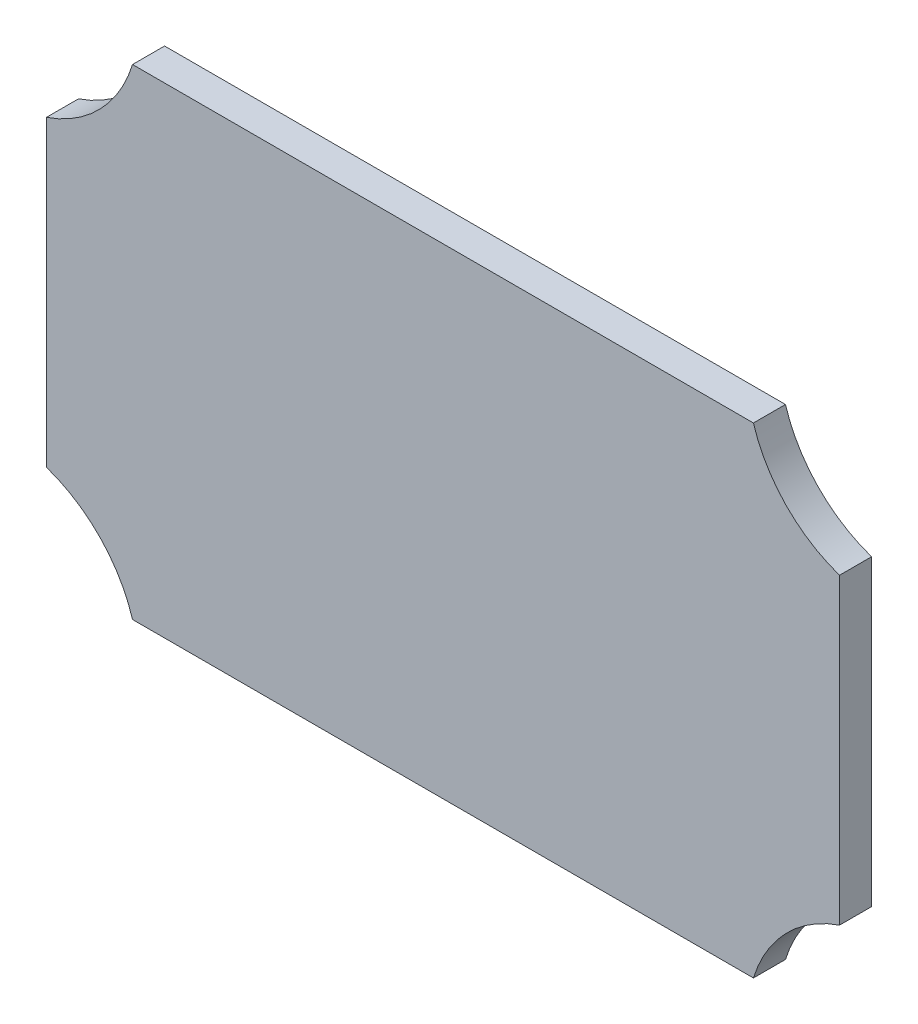
ISO-10303-21;
HEADER;
FILE_DESCRIPTION(('STEP AP214'),'2;1');
FILE_NAME('part.step','',(''),(''),'','','');
FILE_SCHEMA(('AUTOMOTIVE_DESIGN { 1 0 10303 214 1 1 1 1 }'));
ENDSEC;
DATA;
#1=APPLICATION_CONTEXT('core data for automotive mechanical design processes');
#2=APPLICATION_PROTOCOL_DEFINITION('international standard','automotive_design',2000,#1);
#3=PRODUCT_CONTEXT('',#1,'mechanical');
#4=PRODUCT('Part','Part','',(#3));
#5=PRODUCT_RELATED_PRODUCT_CATEGORY('part','',(#4));
#6=PRODUCT_DEFINITION_FORMATION('','',#4);
#7=PRODUCT_DEFINITION_CONTEXT('part definition',#1,'design');
#8=PRODUCT_DEFINITION('design','',#6,#7);
#9=PRODUCT_DEFINITION_SHAPE('','',#8);
#10=(LENGTH_UNIT() NAMED_UNIT(*) SI_UNIT(.MILLI.,.METRE.));
#11=(NAMED_UNIT(*) PLANE_ANGLE_UNIT() SI_UNIT($,.RADIAN.));
#12=(NAMED_UNIT(*) SI_UNIT($,.STERADIAN.) SOLID_ANGLE_UNIT());
#13=UNCERTAINTY_MEASURE_WITH_UNIT(LENGTH_MEASURE(1.E-05),#10,'distance_accuracy_value','');
#14=(GEOMETRIC_REPRESENTATION_CONTEXT(3) GLOBAL_UNCERTAINTY_ASSIGNED_CONTEXT((#13)) GLOBAL_UNIT_ASSIGNED_CONTEXT((#10,
#11,#12)) REPRESENTATION_CONTEXT('',''));
#15=CARTESIAN_POINT('',(0.,0.,0.));
#16=DIRECTION('',(0.,0.,1.));
#17=DIRECTION('',(1.,0.,0.));
#18=AXIS2_PLACEMENT_3D('',#15,#16,#17);
#19=CARTESIAN_POINT('',(-0.495,-0.3,0.02));
#20=DIRECTION('',(0.,0.,-1.));
#21=DIRECTION('',(0.,1.,0.));
#22=AXIS2_PLACEMENT_3D('',#19,#20,#21);
#23=PLANE('',#22);
#24=DIRECTION('',(1.,0.,0.));
#25=VECTOR('',#24,1.);
#26=CARTESIAN_POINT('',(0.495,0.3,0.02));
#27=LINE('',#26,#25);
#28=CARTESIAN_POINT('',(-0.38751923190714,0.3,0.02));
#29=VERTEX_POINT('',#28);
#30=CARTESIAN_POINT('',(0.387519231907269,0.300000000000039,0.02));
#31=VERTEX_POINT('',#30);
#32=EDGE_CURVE('E100',#29,#31,#27,.T.);
#33=ORIENTED_EDGE('',*,*,#32,.T.);
#34=CARTESIAN_POINT('',(0.55,0.35,0.02));
#35=DIRECTION('',(0.,0.,-1.));
#36=DIRECTION('',(-1.,0.,0.));
#37=AXIS2_PLACEMENT_3D('',#34,#35,#36);
#38=CIRCLE('',#37,0.17);
#39=CARTESIAN_POINT('',(0.495,0.189142920578773,0.02));
#40=VERTEX_POINT('',#39);
#41=EDGE_CURVE('E94',#31,#40,#38,.F.);
#42=ORIENTED_EDGE('',*,*,#41,.T.);
#43=DIRECTION('',(0.,1.,0.));
#44=VECTOR('',#43,1.);
#45=CARTESIAN_POINT('',(0.495,-0.3,0.02));
#46=LINE('',#45,#44);
#47=CARTESIAN_POINT('',(0.495,-0.189142920578773,0.02));
#48=VERTEX_POINT('',#47);
#49=EDGE_CURVE('E90',#40,#48,#46,.F.);
#50=ORIENTED_EDGE('',*,*,#49,.T.);
#51=CARTESIAN_POINT('',(0.55,-0.35,0.02));
#52=DIRECTION('',(0.,0.,-1.));
#53=DIRECTION('',(-1.,0.,0.));
#54=AXIS2_PLACEMENT_3D('',#51,#52,#53);
#55=CIRCLE('',#54,0.17);
#56=CARTESIAN_POINT('',(0.38751923190714,-0.3,0.02));
#57=VERTEX_POINT('',#56);
#58=EDGE_CURVE('E20',#48,#57,#55,.F.);
#59=ORIENTED_EDGE('',*,*,#58,.T.);
#60=DIRECTION('',(1.,0.,0.));
#61=VECTOR('',#60,1.);
#62=CARTESIAN_POINT('',(-0.495,-0.3,0.02));
#63=LINE('',#62,#61);
#64=CARTESIAN_POINT('',(-0.387519231907269,-0.30000000000004,0.02));
#65=VERTEX_POINT('',#64);
#66=EDGE_CURVE('E109',#57,#65,#63,.F.);
#67=ORIENTED_EDGE('',*,*,#66,.T.);
#68=CARTESIAN_POINT('',(-0.55,-0.35,0.02));
#69=DIRECTION('',(0.,0.,-1.));
#70=DIRECTION('',(-1.,0.,0.));
#71=AXIS2_PLACEMENT_3D('',#68,#69,#70);
#72=CIRCLE('',#71,0.17);
#73=CARTESIAN_POINT('',(-0.495,-0.189142920578773,0.02));
#74=VERTEX_POINT('',#73);
#75=EDGE_CURVE('E111',#65,#74,#72,.F.);
#76=ORIENTED_EDGE('',*,*,#75,.T.);
#77=DIRECTION('',(0.,1.,0.));
#78=VECTOR('',#77,1.);
#79=CARTESIAN_POINT('',(-0.495,0.3,0.02));
#80=LINE('',#79,#78);
#81=CARTESIAN_POINT('',(-0.49499999999993,0.18914292057857,0.02));
#82=VERTEX_POINT('',#81);
#83=EDGE_CURVE('E104',#74,#82,#80,.T.);
#84=ORIENTED_EDGE('',*,*,#83,.T.);
#85=CARTESIAN_POINT('',(-0.55,0.35,0.02));
#86=DIRECTION('',(0.,0.,-1.));
#87=DIRECTION('',(-1.,0.,0.));
#88=AXIS2_PLACEMENT_3D('',#85,#86,#87);
#89=CIRCLE('',#88,0.17);
#90=EDGE_CURVE('E107',#82,#29,#89,.F.);
#91=ORIENTED_EDGE('',*,*,#90,.T.);
#92=EDGE_LOOP('',(#33,#42,#50,#59,#67,#76,#84,#91));
#93=FACE_BOUND('',#92,.T.);
#94=ADVANCED_FACE('F17',(#93),#23,.T.);
#95=CARTESIAN_POINT('',(0.55,-0.35,0.02));
#96=DIRECTION('',(0.,0.,-1.));
#97=DIRECTION('',(-1.,0.,0.));
#98=AXIS2_PLACEMENT_3D('',#95,#96,#97);
#99=CYLINDRICAL_SURFACE('',#98,0.17);
#100=DIRECTION('',(0.,0.,1.));
#101=VECTOR('',#100,1.);
#102=CARTESIAN_POINT('',(0.387519231907,-0.3,0.02));
#103=LINE('',#102,#101);
#104=CARTESIAN_POINT('',(0.38751923190714,-0.3,0.06));
#105=VERTEX_POINT('',#104);
#106=EDGE_CURVE('E84',#105,#57,#103,.F.);
#107=ORIENTED_EDGE('',*,*,#106,.T.);
#108=ORIENTED_EDGE('',*,*,#58,.F.);
#109=DIRECTION('',(0.,0.,1.));
#110=VECTOR('',#109,1.);
#111=CARTESIAN_POINT('',(0.495,-0.189142920579,0.02));
#112=LINE('',#111,#110);
#113=CARTESIAN_POINT('',(0.495,-0.189142920578773,0.06));
#114=VERTEX_POINT('',#113);
#115=EDGE_CURVE('E83',#48,#114,#112,.T.);
#116=ORIENTED_EDGE('',*,*,#115,.T.);
#117=CARTESIAN_POINT('',(0.55,-0.35,0.06));
#118=DIRECTION('',(0.,0.,-1.));
#119=DIRECTION('',(-1.,0.,0.));
#120=AXIS2_PLACEMENT_3D('',#117,#118,#119);
#121=CIRCLE('',#120,0.17);
#122=EDGE_CURVE('E91',#114,#105,#121,.F.);
#123=ORIENTED_EDGE('',*,*,#122,.T.);
#124=EDGE_LOOP('',(#107,#108,#116,#123));
#125=FACE_BOUND('',#124,.T.);
#126=ADVANCED_FACE('F81',(#125),#99,.F.);
#127=CARTESIAN_POINT('',(-0.495,-0.3,0.02));
#128=DIRECTION('',(0.,1.,0.));
#129=DIRECTION('',(0.,0.,1.));
#130=AXIS2_PLACEMENT_3D('',#127,#128,#129);
#131=PLANE('',#130);
#132=DIRECTION('',(0.,0.,-1.));
#133=VECTOR('',#132,1.);
#134=CARTESIAN_POINT('',(-0.387519231907257,-0.300000000000079,0.02));
#135=LINE('',#134,#133);
#136=CARTESIAN_POINT('',(-0.387519231907269,-0.30000000000004,0.06));
#137=VERTEX_POINT('',#136);
#138=EDGE_CURVE('E126',#137,#65,#135,.T.);
#139=ORIENTED_EDGE('',*,*,#138,.T.);
#140=ORIENTED_EDGE('',*,*,#66,.F.);
#141=ORIENTED_EDGE('',*,*,#106,.F.);
#142=DIRECTION('',(1.,0.,0.));
#143=VECTOR('',#142,1.);
#144=CARTESIAN_POINT('',(-0.495,-0.3,0.06));
#145=LINE('',#144,#143);
#146=EDGE_CURVE('E122',#105,#137,#145,.F.);
#147=ORIENTED_EDGE('',*,*,#146,.T.);
#148=EDGE_LOOP('',(#139,#140,#141,#147));
#149=FACE_BOUND('',#148,.T.);
#150=ADVANCED_FACE('F161',(#149),#131,.F.);
#151=CARTESIAN_POINT('',(-0.55,-0.35,0.02));
#152=DIRECTION('',(0.,0.,-1.));
#153=DIRECTION('',(-1.,0.,0.));
#154=AXIS2_PLACEMENT_3D('',#151,#152,#153);
#155=CYLINDRICAL_SURFACE('',#154,0.17);
#156=CARTESIAN_POINT('',(-0.55,-0.35,0.06));
#157=DIRECTION('',(0.,0.,-1.));
#158=DIRECTION('',(-1.,0.,0.));
#159=AXIS2_PLACEMENT_3D('',#156,#157,#158);
#160=CIRCLE('',#159,0.17);
#161=CARTESIAN_POINT('',(-0.495,-0.189142920578773,0.06));
#162=VERTEX_POINT('',#161);
#163=EDGE_CURVE('E119',#137,#162,#160,.F.);
#164=ORIENTED_EDGE('',*,*,#163,.T.);
#165=DIRECTION('',(0.,0.,-1.));
#166=VECTOR('',#165,1.);
#167=CARTESIAN_POINT('',(-0.495,-0.189142920579,0.02));
#168=LINE('',#167,#166);
#169=EDGE_CURVE('E108',#162,#74,#168,.T.);
#170=ORIENTED_EDGE('',*,*,#169,.T.);
#171=ORIENTED_EDGE('',*,*,#75,.F.);
#172=ORIENTED_EDGE('',*,*,#138,.F.);
#173=EDGE_LOOP('',(#164,#170,#171,#172));
#174=FACE_BOUND('',#173,.T.);
#175=ADVANCED_FACE('F160',(#174),#155,.F.);
#176=CARTESIAN_POINT('',(-0.495,0.3,0.02));
#177=DIRECTION('',(1.,0.,0.));
#178=DIRECTION('',(0.,0.,-1.));
#179=AXIS2_PLACEMENT_3D('',#176,#177,#178);
#180=PLANE('',#179);
#181=DIRECTION('',(0.,0.,-1.));
#182=VECTOR('',#181,1.);
#183=CARTESIAN_POINT('',(-0.494999999999861,0.189142920578593,0.02));
#184=LINE('',#183,#182);
#185=CARTESIAN_POINT('',(-0.49499999999993,0.18914292057857,0.06));
#186=VERTEX_POINT('',#185);
#187=EDGE_CURVE('E125',#186,#82,#184,.T.);
#188=ORIENTED_EDGE('',*,*,#187,.T.);
#189=ORIENTED_EDGE('',*,*,#83,.F.);
#190=ORIENTED_EDGE('',*,*,#169,.F.);
#191=DIRECTION('',(0.,1.,0.));
#192=VECTOR('',#191,1.);
#193=CARTESIAN_POINT('',(-0.495,-0.3,0.06));
#194=LINE('',#193,#192);
#195=EDGE_CURVE('E118',#162,#186,#194,.T.);
#196=ORIENTED_EDGE('',*,*,#195,.T.);
#197=EDGE_LOOP('',(#188,#189,#190,#196));
#198=FACE_BOUND('',#197,.T.);
#199=ADVANCED_FACE('F156',(#198),#180,.F.);
#200=CARTESIAN_POINT('',(-0.55,0.35,0.02));
#201=DIRECTION('',(0.,0.,-1.));
#202=DIRECTION('',(-1.,0.,0.));
#203=AXIS2_PLACEMENT_3D('',#200,#201,#202);
#204=CYLINDRICAL_SURFACE('',#203,0.17);
#205=CARTESIAN_POINT('',(-0.55,0.35,0.06));
#206=DIRECTION('',(0.,0.,-1.));
#207=DIRECTION('',(-1.,0.,0.));
#208=AXIS2_PLACEMENT_3D('',#205,#206,#207);
#209=CIRCLE('',#208,0.17);
#210=CARTESIAN_POINT('',(-0.38751923190714,0.3,0.06));
#211=VERTEX_POINT('',#210);
#212=EDGE_CURVE('E115',#186,#211,#209,.F.);
#213=ORIENTED_EDGE('',*,*,#212,.T.);
#214=DIRECTION('',(0.,0.,-1.));
#215=VECTOR('',#214,1.);
#216=CARTESIAN_POINT('',(-0.387519231907,0.3,0.02));
#217=LINE('',#216,#215);
#218=EDGE_CURVE('E103',#211,#29,#217,.T.);
#219=ORIENTED_EDGE('',*,*,#218,.T.);
#220=ORIENTED_EDGE('',*,*,#90,.F.);
#221=ORIENTED_EDGE('',*,*,#187,.F.);
#222=EDGE_LOOP('',(#213,#219,#220,#221));
#223=FACE_BOUND('',#222,.T.);
#224=ADVANCED_FACE('F154',(#223),#204,.F.);
#225=CARTESIAN_POINT('',(0.495,0.3,0.02));
#226=DIRECTION('',(0.,-1.,0.));
#227=DIRECTION('',(0.,0.,-1.));
#228=AXIS2_PLACEMENT_3D('',#225,#226,#227);
#229=PLANE('',#228);
#230=DIRECTION('',(0.,0.,-1.));
#231=VECTOR('',#230,1.);
#232=CARTESIAN_POINT('',(0.387519231907257,0.300000000000079,0.02));
#233=LINE('',#232,#231);
#234=CARTESIAN_POINT('',(0.387519231907269,0.300000000000039,0.06));
#235=VERTEX_POINT('',#234);
#236=EDGE_CURVE('E102',#235,#31,#233,.T.);
#237=ORIENTED_EDGE('',*,*,#236,.T.);
#238=ORIENTED_EDGE('',*,*,#32,.F.);
#239=ORIENTED_EDGE('',*,*,#218,.F.);
#240=DIRECTION('',(1.,0.,0.));
#241=VECTOR('',#240,1.);
#242=CARTESIAN_POINT('',(-0.495,0.3,0.0600000000000001));
#243=LINE('',#242,#241);
#244=EDGE_CURVE('E114',#211,#235,#243,.T.);
#245=ORIENTED_EDGE('',*,*,#244,.T.);
#246=EDGE_LOOP('',(#237,#238,#239,#245));
#247=FACE_BOUND('',#246,.T.);
#248=ADVANCED_FACE('F146',(#247),#229,.F.);
#249=CARTESIAN_POINT('',(0.55,0.35,0.02));
#250=DIRECTION('',(0.,0.,-1.));
#251=DIRECTION('',(-1.,0.,0.));
#252=AXIS2_PLACEMENT_3D('',#249,#250,#251);
#253=CYLINDRICAL_SURFACE('',#252,0.17);
#254=DIRECTION('',(0.,0.,1.));
#255=VECTOR('',#254,1.);
#256=CARTESIAN_POINT('',(0.495,0.189142920579,0.02));
#257=LINE('',#256,#255);
#258=CARTESIAN_POINT('',(0.495,0.189142920578773,0.06));
#259=VERTEX_POINT('',#258);
#260=EDGE_CURVE('E34',#259,#40,#257,.F.);
#261=ORIENTED_EDGE('',*,*,#260,.T.);
#262=ORIENTED_EDGE('',*,*,#41,.F.);
#263=ORIENTED_EDGE('',*,*,#236,.F.);
#264=CARTESIAN_POINT('',(0.55,0.35,0.06));
#265=DIRECTION('',(0.,0.,-1.));
#266=DIRECTION('',(-1.,0.,0.));
#267=AXIS2_PLACEMENT_3D('',#264,#265,#266);
#268=CIRCLE('',#267,0.17);
#269=EDGE_CURVE('E26',#235,#259,#268,.F.);
#270=ORIENTED_EDGE('',*,*,#269,.T.);
#271=EDGE_LOOP('',(#261,#262,#263,#270));
#272=FACE_BOUND('',#271,.T.);
#273=ADVANCED_FACE('F163',(#272),#253,.F.);
#274=CARTESIAN_POINT('',(0.495,-0.3,0.02));
#275=DIRECTION('',(-1.,0.,0.));
#276=DIRECTION('',(0.,0.,1.));
#277=AXIS2_PLACEMENT_3D('',#274,#275,#276);
#278=PLANE('',#277);
#279=ORIENTED_EDGE('',*,*,#115,.F.);
#280=ORIENTED_EDGE('',*,*,#49,.F.);
#281=ORIENTED_EDGE('',*,*,#260,.F.);
#282=DIRECTION('',(0.,1.,0.));
#283=VECTOR('',#282,1.);
#284=CARTESIAN_POINT('',(0.495,-0.3,0.06));
#285=LINE('',#284,#283);
#286=EDGE_CURVE('E11',#259,#114,#285,.F.);
#287=ORIENTED_EDGE('',*,*,#286,.T.);
#288=EDGE_LOOP('',(#279,#280,#281,#287));
#289=FACE_BOUND('',#288,.T.);
#290=ADVANCED_FACE('F89',(#289),#278,.F.);
#291=CARTESIAN_POINT('',(-0.495,-0.3,0.06));
#292=DIRECTION('',(0.,0.,-1.));
#293=DIRECTION('',(0.,1.,0.));
#294=AXIS2_PLACEMENT_3D('',#291,#292,#293);
#295=PLANE('',#294);
#296=ORIENTED_EDGE('',*,*,#269,.F.);
#297=ORIENTED_EDGE('',*,*,#244,.F.);
#298=ORIENTED_EDGE('',*,*,#212,.F.);
#299=ORIENTED_EDGE('',*,*,#195,.F.);
#300=ORIENTED_EDGE('',*,*,#163,.F.);
#301=ORIENTED_EDGE('',*,*,#146,.F.);
#302=ORIENTED_EDGE('',*,*,#122,.F.);
#303=ORIENTED_EDGE('',*,*,#286,.F.);
#304=EDGE_LOOP('',(#296,#297,#298,#299,#300,#301,#302,#303));
#305=FACE_BOUND('',#304,.T.);
#306=ADVANCED_FACE('F151',(#305),#295,.F.);
#307=CLOSED_SHELL('',(#94,#126,#150,#175,#199,#224,#248,#273,#290,#306));
#308=MANIFOLD_SOLID_BREP('B1',#307);
#309=ADVANCED_BREP_SHAPE_REPRESENTATION('',(#18,#308),#14);
#310=SHAPE_DEFINITION_REPRESENTATION(#9,#309);
ENDSEC;
END-ISO-10303-21;
